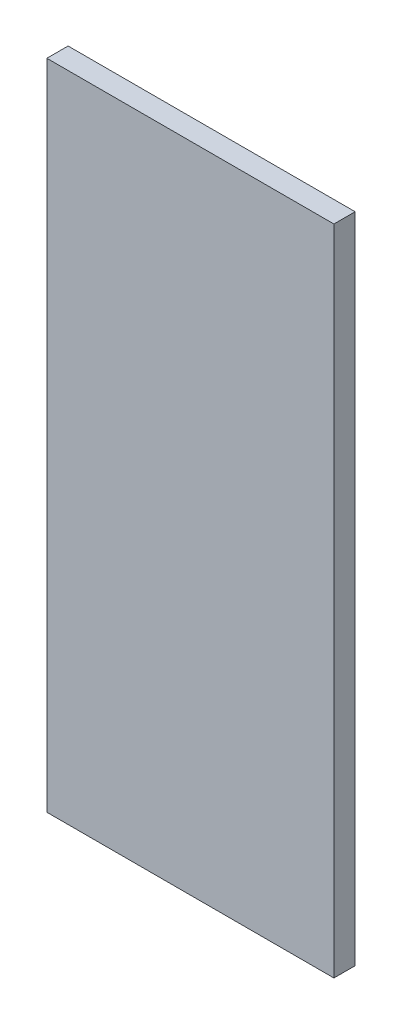
ISO-10303-21;
HEADER;
FILE_DESCRIPTION(('STEP AP214'),'2;1');
FILE_NAME('part.step','',(''),(''),'','','');
FILE_SCHEMA(('AUTOMOTIVE_DESIGN { 1 0 10303 214 1 1 1 1 }'));
ENDSEC;
DATA;
#1=APPLICATION_CONTEXT('core data for automotive mechanical design processes');
#2=APPLICATION_PROTOCOL_DEFINITION('international standard','automotive_design',2000,#1);
#3=PRODUCT_CONTEXT('',#1,'mechanical');
#4=PRODUCT('Part','Part','',(#3));
#5=PRODUCT_RELATED_PRODUCT_CATEGORY('part','',(#4));
#6=PRODUCT_DEFINITION_FORMATION('','',#4);
#7=PRODUCT_DEFINITION_CONTEXT('part definition',#1,'design');
#8=PRODUCT_DEFINITION('design','',#6,#7);
#9=PRODUCT_DEFINITION_SHAPE('','',#8);
#10=(LENGTH_UNIT() NAMED_UNIT(*) SI_UNIT(.MILLI.,.METRE.));
#11=(NAMED_UNIT(*) PLANE_ANGLE_UNIT() SI_UNIT($,.RADIAN.));
#12=(NAMED_UNIT(*) SI_UNIT($,.STERADIAN.) SOLID_ANGLE_UNIT());
#13=UNCERTAINTY_MEASURE_WITH_UNIT(LENGTH_MEASURE(1.E-05),#10,'distance_accuracy_value','');
#14=(GEOMETRIC_REPRESENTATION_CONTEXT(3) GLOBAL_UNCERTAINTY_ASSIGNED_CONTEXT((#13)) GLOBAL_UNIT_ASSIGNED_CONTEXT((#10,
#11,#12)) REPRESENTATION_CONTEXT('',''));
#15=CARTESIAN_POINT('',(0.,0.,0.));
#16=DIRECTION('',(0.,0.,1.));
#17=DIRECTION('',(1.,0.,0.));
#18=AXIS2_PLACEMENT_3D('',#15,#16,#17);
#19=CARTESIAN_POINT('',(0.,-15.4690455762306,-1.20000000000003));
#20=DIRECTION('',(0.,0.,1.));
#21=DIRECTION('',(1.,0.,0.));
#22=AXIS2_PLACEMENT_3D('',#19,#20,#21);
#23=PLANE('',#22);
#24=DIRECTION('',(1.,0.,0.));
#25=VECTOR('',#24,1.);
#26=CARTESIAN_POINT('',(0.,-14.8690455762306,-1.20000000000003));
#27=LINE('',#26,#25);
#28=CARTESIAN_POINT('',(-11.2173004717932,-14.8690455762306,-1.20000000000003));
#29=VERTEX_POINT('',#28);
#30=CARTESIAN_POINT('',(11.2173004717932,-14.8690455762306,-1.20000000000003));
#31=VERTEX_POINT('',#30);
#32=EDGE_CURVE('E117',#29,#31,#27,.T.);
#33=ORIENTED_EDGE('',*,*,#32,.T.);
#34=DIRECTION('',(0.,1.,0.));
#35=VECTOR('',#34,1.);
#36=CARTESIAN_POINT('',(11.2173004717932,-15.4690455762306,-1.20000000000003));
#37=LINE('',#36,#35);
#38=CARTESIAN_POINT('',(11.2173004717932,-15.4690455762306,-1.20000000000003));
#39=VERTEX_POINT('',#38);
#40=EDGE_CURVE('E12',#39,#31,#37,.T.);
#41=ORIENTED_EDGE('',*,*,#40,.F.);
#42=DIRECTION('',(1.,0.,0.));
#43=VECTOR('',#42,1.);
#44=CARTESIAN_POINT('',(0.,-15.4690455762306,-1.20000000000003));
#45=LINE('',#44,#43);
#46=CARTESIAN_POINT('',(-11.2173004717932,-15.4690455762306,-1.20000000000003));
#47=VERTEX_POINT('',#46);
#48=EDGE_CURVE('E105',#47,#39,#45,.T.);
#49=ORIENTED_EDGE('',*,*,#48,.F.);
#50=DIRECTION('',(0.,1.,0.));
#51=VECTOR('',#50,1.);
#52=CARTESIAN_POINT('',(-11.2173004717932,-15.4690455762306,-1.20000000000003));
#53=LINE('',#52,#51);
#54=EDGE_CURVE('E113',#47,#29,#53,.T.);
#55=ORIENTED_EDGE('',*,*,#54,.T.);
#56=EDGE_LOOP('',(#33,#41,#49,#55));
#57=FACE_BOUND('',#56,.T.);
#58=ADVANCED_FACE('F54',(#57),#23,.F.);
#59=CARTESIAN_POINT('',(11.2173004717932,-15.4690455762306,0.));
#60=DIRECTION('',(-1.,0.,0.));
#61=DIRECTION('',(0.,0.,1.));
#62=AXIS2_PLACEMENT_3D('',#59,#60,#61);
#63=PLANE('',#62);
#64=DIRECTION('',(0.,0.,1.));
#65=VECTOR('',#64,1.);
#66=CARTESIAN_POINT('',(11.2173004717932,-14.8690455762306,0.));
#67=LINE('',#66,#65);
#68=CARTESIAN_POINT('',(11.2173004717933,-14.8690455762306,-0.80000000000003));
#69=VERTEX_POINT('',#68);
#70=EDGE_CURVE('E109',#31,#69,#67,.T.);
#71=ORIENTED_EDGE('',*,*,#70,.T.);
#72=DIRECTION('',(0.,1.,0.));
#73=VECTOR('',#72,1.);
#74=CARTESIAN_POINT('',(11.2173004717933,-15.4690455762306,-0.80000000000003));
#75=LINE('',#74,#73);
#76=CARTESIAN_POINT('',(11.2173004717933,-15.4690455762306,-0.80000000000003));
#77=VERTEX_POINT('',#76);
#78=EDGE_CURVE('E62',#77,#69,#75,.T.);
#79=ORIENTED_EDGE('',*,*,#78,.F.);
#80=DIRECTION('',(0.,0.,1.));
#81=VECTOR('',#80,1.);
#82=CARTESIAN_POINT('',(11.2173004717932,-15.4690455762306,0.));
#83=LINE('',#82,#81);
#84=EDGE_CURVE('E100',#39,#77,#83,.T.);
#85=ORIENTED_EDGE('',*,*,#84,.F.);
#86=ORIENTED_EDGE('',*,*,#40,.T.);
#87=EDGE_LOOP('',(#71,#79,#85,#86));
#88=FACE_BOUND('',#87,.T.);
#89=ADVANCED_FACE('F108',(#88),#63,.F.);
#90=CARTESIAN_POINT('',(0.,-15.4690455762306,-0.80000000000003));
#91=DIRECTION('',(0.,0.,-1.));
#92=DIRECTION('',(-1.,0.,0.));
#93=AXIS2_PLACEMENT_3D('',#90,#91,#92);
#94=PLANE('',#93);
#95=DIRECTION('',(-1.,0.,0.));
#96=VECTOR('',#95,1.);
#97=CARTESIAN_POINT('',(0.,-14.8690455762306,-0.80000000000003));
#98=LINE('',#97,#96);
#99=CARTESIAN_POINT('',(-11.2173004717933,-14.8690455762306,-0.80000000000003));
#100=VERTEX_POINT('',#99);
#101=EDGE_CURVE('E87',#69,#100,#98,.T.);
#102=ORIENTED_EDGE('',*,*,#101,.T.);
#103=DIRECTION('',(0.,1.,0.));
#104=VECTOR('',#103,1.);
#105=CARTESIAN_POINT('',(-11.2173004717933,-15.4690455762306,-0.80000000000003));
#106=LINE('',#105,#104);
#107=CARTESIAN_POINT('',(-11.2173004717933,-15.4690455762306,-0.80000000000003));
#108=VERTEX_POINT('',#107);
#109=EDGE_CURVE('E110',#108,#100,#106,.T.);
#110=ORIENTED_EDGE('',*,*,#109,.F.);
#111=DIRECTION('',(-1.,0.,0.));
#112=VECTOR('',#111,1.);
#113=CARTESIAN_POINT('',(0.,-15.4690455762306,-0.80000000000003));
#114=LINE('',#113,#112);
#115=EDGE_CURVE('E103',#77,#108,#114,.T.);
#116=ORIENTED_EDGE('',*,*,#115,.F.);
#117=ORIENTED_EDGE('',*,*,#78,.T.);
#118=EDGE_LOOP('',(#102,#110,#116,#117));
#119=FACE_BOUND('',#118,.T.);
#120=ADVANCED_FACE('F111',(#119),#94,.F.);
#121=CARTESIAN_POINT('',(-11.2173004717932,-15.4690455762306,0.));
#122=DIRECTION('',(1.,0.,0.));
#123=DIRECTION('',(0.,0.,-1.));
#124=AXIS2_PLACEMENT_3D('',#121,#122,#123);
#125=PLANE('',#124);
#126=DIRECTION('',(0.,0.,-1.));
#127=VECTOR('',#126,1.);
#128=CARTESIAN_POINT('',(-11.2173004717932,-14.8690455762306,0.));
#129=LINE('',#128,#127);
#130=EDGE_CURVE('E93',#100,#29,#129,.T.);
#131=ORIENTED_EDGE('',*,*,#130,.T.);
#132=ORIENTED_EDGE('',*,*,#54,.F.);
#133=DIRECTION('',(0.,0.,-1.));
#134=VECTOR('',#133,1.);
#135=CARTESIAN_POINT('',(-11.2173004717932,-15.4690455762306,0.));
#136=LINE('',#135,#134);
#137=EDGE_CURVE('E70',#108,#47,#136,.T.);
#138=ORIENTED_EDGE('',*,*,#137,.F.);
#139=ORIENTED_EDGE('',*,*,#109,.T.);
#140=EDGE_LOOP('',(#131,#132,#138,#139));
#141=FACE_BOUND('',#140,.T.);
#142=ADVANCED_FACE('F124',(#141),#125,.F.);
#143=CARTESIAN_POINT('',(0.,-15.4690455762306,0.));
#144=DIRECTION('',(0.,-1.,0.));
#145=DIRECTION('',(0.,0.,-1.));
#146=AXIS2_PLACEMENT_3D('',#143,#144,#145);
#147=PLANE('',#146);
#148=ORIENTED_EDGE('',*,*,#48,.T.);
#149=ORIENTED_EDGE('',*,*,#84,.T.);
#150=ORIENTED_EDGE('',*,*,#115,.T.);
#151=ORIENTED_EDGE('',*,*,#137,.T.);
#152=EDGE_LOOP('',(#148,#149,#150,#151));
#153=FACE_BOUND('',#152,.T.);
#154=ADVANCED_FACE('F101',(#153),#147,.T.);
#155=CARTESIAN_POINT('',(0.,-14.8690455762306,0.));
#156=DIRECTION('',(0.,-1.,0.));
#157=DIRECTION('',(0.,0.,-1.));
#158=AXIS2_PLACEMENT_3D('',#155,#156,#157);
#159=PLANE('',#158);
#160=ORIENTED_EDGE('',*,*,#32,.F.);
#161=ORIENTED_EDGE('',*,*,#130,.F.);
#162=ORIENTED_EDGE('',*,*,#101,.F.);
#163=ORIENTED_EDGE('',*,*,#70,.F.);
#164=EDGE_LOOP('',(#160,#161,#162,#163));
#165=FACE_BOUND('',#164,.T.);
#166=ADVANCED_FACE('F127',(#165),#159,.F.);
#167=CLOSED_SHELL('',(#58,#89,#120,#142,#154,#166));
#168=MANIFOLD_SOLID_BREP('B2',#167);
#169=CARTESIAN_POINT('',(11.2173004717933,0.,-1.));
#170=DIRECTION('',(1.,0.,0.));
#171=DIRECTION('',(0.,0.,-1.));
#172=AXIS2_PLACEMENT_3D('',#169,#170,#171);
#173=PLANE('',#172);
#174=DIRECTION('',(0.,1.,0.));
#175=VECTOR('',#174,1.);
#176=CARTESIAN_POINT('',(11.2173004717933,0.,0.));
#177=LINE('',#176,#175);
#178=CARTESIAN_POINT('',(11.2173004717933,-14.8690455762306,0.));
#179=VERTEX_POINT('',#178);
#180=CARTESIAN_POINT('',(11.2173004717933,44.0338466836087,0.));
#181=VERTEX_POINT('',#180);
#182=EDGE_CURVE('E262',#179,#181,#177,.T.);
#183=ORIENTED_EDGE('',*,*,#182,.F.);
#184=DIRECTION('',(0.,0.,1.));
#185=VECTOR('',#184,1.);
#186=CARTESIAN_POINT('',(11.2173004717933,-14.8690455762306,-1.));
#187=LINE('',#186,#185);
#188=CARTESIAN_POINT('',(11.2173004717933,-14.8690455762306,-1.));
#189=VERTEX_POINT('',#188);
#190=EDGE_CURVE('E52',#189,#179,#187,.T.);
#191=ORIENTED_EDGE('',*,*,#190,.F.);
#192=DIRECTION('',(0.,1.,0.));
#193=VECTOR('',#192,1.);
#194=CARTESIAN_POINT('',(11.2173004717933,0.,-1.));
#195=LINE('',#194,#193);
#196=CARTESIAN_POINT('',(11.2173004717933,44.0338466836087,-1.));
#197=VERTEX_POINT('',#196);
#198=EDGE_CURVE('E247',#189,#197,#195,.T.);
#199=ORIENTED_EDGE('',*,*,#198,.T.);
#200=DIRECTION('',(0.,0.,1.));
#201=VECTOR('',#200,1.);
#202=CARTESIAN_POINT('',(11.2173004717933,44.0338466836087,-1.));
#203=LINE('',#202,#201);
#204=EDGE_CURVE('E215',#197,#181,#203,.T.);
#205=ORIENTED_EDGE('',*,*,#204,.T.);
#206=EDGE_LOOP('',(#183,#191,#199,#205));
#207=FACE_BOUND('',#206,.T.);
#208=ADVANCED_FACE('F199',(#207),#173,.T.);
#209=CARTESIAN_POINT('',(0.,-14.8690455762306,-1.));
#210=DIRECTION('',(0.,1.,0.));
#211=DIRECTION('',(0.,0.,1.));
#212=AXIS2_PLACEMENT_3D('',#209,#210,#211);
#213=PLANE('',#212);
#214=DIRECTION('',(-1.,0.,0.));
#215=VECTOR('',#214,1.);
#216=CARTESIAN_POINT('',(0.,-14.8690455762306,0.));
#217=LINE('',#216,#215);
#218=CARTESIAN_POINT('',(-11.2173004717933,-14.8690455762306,0.));
#219=VERTEX_POINT('',#218);
#220=EDGE_CURVE('E253',#179,#219,#217,.T.);
#221=ORIENTED_EDGE('',*,*,#220,.T.);
#222=DIRECTION('',(0.,0.,1.));
#223=VECTOR('',#222,1.);
#224=CARTESIAN_POINT('',(-11.2173004717933,-14.8690455762306,-1.));
#225=LINE('',#224,#223);
#226=CARTESIAN_POINT('',(-11.2173004717933,-14.8690455762306,-1.));
#227=VERTEX_POINT('',#226);
#228=EDGE_CURVE('E207',#227,#219,#225,.T.);
#229=ORIENTED_EDGE('',*,*,#228,.F.);
#230=DIRECTION('',(-1.,0.,0.));
#231=VECTOR('',#230,1.);
#232=CARTESIAN_POINT('',(0.,-14.8690455762306,-1.));
#233=LINE('',#232,#231);
#234=EDGE_CURVE('E241',#189,#227,#233,.T.);
#235=ORIENTED_EDGE('',*,*,#234,.F.);
#236=ORIENTED_EDGE('',*,*,#190,.T.);
#237=EDGE_LOOP('',(#221,#229,#235,#236));
#238=FACE_BOUND('',#237,.T.);
#239=ADVANCED_FACE('F251',(#238),#213,.F.);
#240=CARTESIAN_POINT('',(-11.2173004717933,0.,-1.));
#241=DIRECTION('',(1.,0.,0.));
#242=DIRECTION('',(0.,0.,-1.));
#243=AXIS2_PLACEMENT_3D('',#240,#241,#242);
#244=PLANE('',#243);
#245=DIRECTION('',(0.,1.,0.));
#246=VECTOR('',#245,1.);
#247=CARTESIAN_POINT('',(-11.2173004717933,0.,0.));
#248=LINE('',#247,#246);
#249=CARTESIAN_POINT('',(-11.2173004717933,44.0338466836087,0.));
#250=VERTEX_POINT('',#249);
#251=EDGE_CURVE('E265',#219,#250,#248,.T.);
#252=ORIENTED_EDGE('',*,*,#251,.T.);
#253=DIRECTION('',(0.,0.,1.));
#254=VECTOR('',#253,1.);
#255=CARTESIAN_POINT('',(-11.2173004717933,44.0338466836087,-1.));
#256=LINE('',#255,#254);
#257=CARTESIAN_POINT('',(-11.2173004717933,44.0338466836087,-1.));
#258=VERTEX_POINT('',#257);
#259=EDGE_CURVE('E229',#258,#250,#256,.T.);
#260=ORIENTED_EDGE('',*,*,#259,.F.);
#261=DIRECTION('',(0.,1.,0.));
#262=VECTOR('',#261,1.);
#263=CARTESIAN_POINT('',(-11.2173004717933,0.,-1.));
#264=LINE('',#263,#262);
#265=EDGE_CURVE('E246',#227,#258,#264,.T.);
#266=ORIENTED_EDGE('',*,*,#265,.F.);
#267=ORIENTED_EDGE('',*,*,#228,.T.);
#268=EDGE_LOOP('',(#252,#260,#266,#267));
#269=FACE_BOUND('',#268,.T.);
#270=ADVANCED_FACE('F256',(#269),#244,.F.);
#271=CARTESIAN_POINT('',(0.,44.0338466836087,-1.));
#272=DIRECTION('',(0.,1.,0.));
#273=DIRECTION('',(0.,0.,1.));
#274=AXIS2_PLACEMENT_3D('',#271,#272,#273);
#275=PLANE('',#274);
#276=DIRECTION('',(-1.,0.,0.));
#277=VECTOR('',#276,1.);
#278=CARTESIAN_POINT('',(0.,44.0338466836087,0.));
#279=LINE('',#278,#277);
#280=EDGE_CURVE('E267',#181,#250,#279,.T.);
#281=ORIENTED_EDGE('',*,*,#280,.F.);
#282=ORIENTED_EDGE('',*,*,#204,.F.);
#283=DIRECTION('',(-1.,0.,0.));
#284=VECTOR('',#283,1.);
#285=CARTESIAN_POINT('',(0.,44.0338466836087,-1.));
#286=LINE('',#285,#284);
#287=EDGE_CURVE('E257',#197,#258,#286,.T.);
#288=ORIENTED_EDGE('',*,*,#287,.T.);
#289=ORIENTED_EDGE('',*,*,#259,.T.);
#290=EDGE_LOOP('',(#281,#282,#288,#289));
#291=FACE_BOUND('',#290,.T.);
#292=ADVANCED_FACE('F272',(#291),#275,.T.);
#293=CARTESIAN_POINT('',(0.,0.,-1.));
#294=DIRECTION('',(0.,0.,-1.));
#295=DIRECTION('',(-1.,0.,0.));
#296=AXIS2_PLACEMENT_3D('',#293,#294,#295);
#297=PLANE('',#296);
#298=ORIENTED_EDGE('',*,*,#198,.F.);
#299=ORIENTED_EDGE('',*,*,#234,.T.);
#300=ORIENTED_EDGE('',*,*,#265,.T.);
#301=ORIENTED_EDGE('',*,*,#287,.F.);
#302=EDGE_LOOP('',(#298,#299,#300,#301));
#303=FACE_BOUND('',#302,.T.);
#304=ADVANCED_FACE('F243',(#303),#297,.T.);
#305=CARTESIAN_POINT('',(0.,0.,0.));
#306=DIRECTION('',(0.,0.,-1.));
#307=DIRECTION('',(-1.,0.,0.));
#308=AXIS2_PLACEMENT_3D('',#305,#306,#307);
#309=PLANE('',#308);
#310=ORIENTED_EDGE('',*,*,#182,.T.);
#311=ORIENTED_EDGE('',*,*,#280,.T.);
#312=ORIENTED_EDGE('',*,*,#251,.F.);
#313=ORIENTED_EDGE('',*,*,#220,.F.);
#314=EDGE_LOOP('',(#310,#311,#312,#313));
#315=FACE_BOUND('',#314,.T.);
#316=ADVANCED_FACE('F279',(#315),#309,.F.);
#317=CLOSED_SHELL('',(#208,#239,#270,#292,#304,#316));
#318=MANIFOLD_SOLID_BREP('B6',#317);
#319=CARTESIAN_POINT('',(13.5173004717932,0.,2.));
#320=DIRECTION('',(1.,0.,0.));
#321=DIRECTION('',(0.,0.,-1.));
#322=AXIS2_PLACEMENT_3D('',#319,#320,#321);
#323=PLANE('',#322);
#324=DIRECTION('',(0.,-1.,0.));
#325=VECTOR('',#324,1.);
#326=CARTESIAN_POINT('',(13.5173004717932,0.,0.));
#327=LINE('',#326,#325);
#328=CARTESIAN_POINT('',(13.5173004717932,46.3338466836086,0.));
#329=VERTEX_POINT('',#328);
#330=CARTESIAN_POINT('',(13.5173004717932,-15.1690455762306,0.));
#331=VERTEX_POINT('',#330);
#332=EDGE_CURVE('E386',#329,#331,#327,.T.);
#333=ORIENTED_EDGE('',*,*,#332,.F.);
#334=DIRECTION('',(0.,0.,-1.));
#335=VECTOR('',#334,1.);
#336=CARTESIAN_POINT('',(13.5173004717932,46.3338466836086,2.));
#337=LINE('',#336,#335);
#338=CARTESIAN_POINT('',(13.5173004717932,46.3338466836086,2.));
#339=VERTEX_POINT('',#338);
#340=EDGE_CURVE('E197',#339,#329,#337,.T.);
#341=ORIENTED_EDGE('',*,*,#340,.F.);
#342=DIRECTION('',(0.,-1.,0.));
#343=VECTOR('',#342,1.);
#344=CARTESIAN_POINT('',(13.5173004717932,0.,2.));
#345=LINE('',#344,#343);
#346=CARTESIAN_POINT('',(13.5173004717932,-15.1690455762306,2.));
#347=VERTEX_POINT('',#346);
#348=EDGE_CURVE('E380',#339,#347,#345,.T.);
#349=ORIENTED_EDGE('',*,*,#348,.T.);
#350=DIRECTION('',(0.,0.,-1.));
#351=VECTOR('',#350,1.);
#352=CARTESIAN_POINT('',(13.5173004717932,-15.1690455762306,2.));
#353=LINE('',#352,#351);
#354=EDGE_CURVE('E361',#347,#331,#353,.T.);
#355=ORIENTED_EDGE('',*,*,#354,.T.);
#356=EDGE_LOOP('',(#333,#341,#349,#355));
#357=FACE_BOUND('',#356,.T.);
#358=ADVANCED_FACE('F323',(#357),#323,.T.);
#359=CARTESIAN_POINT('',(0.,46.3338466836086,2.));
#360=DIRECTION('',(0.,1.,0.));
#361=DIRECTION('',(0.,0.,1.));
#362=AXIS2_PLACEMENT_3D('',#359,#360,#361);
#363=PLANE('',#362);
#364=DIRECTION('',(1.,0.,0.));
#365=VECTOR('',#364,1.);
#366=CARTESIAN_POINT('',(0.,46.3338466836086,0.));
#367=LINE('',#366,#365);
#368=CARTESIAN_POINT('',(-13.5173004717932,46.3338466836086,0.));
#369=VERTEX_POINT('',#368);
#370=EDGE_CURVE('E374',#369,#329,#367,.T.);
#371=ORIENTED_EDGE('',*,*,#370,.F.);
#372=DIRECTION('',(0.,0.,-1.));
#373=VECTOR('',#372,1.);
#374=CARTESIAN_POINT('',(-13.5173004717932,46.3338466836086,2.));
#375=LINE('',#374,#373);
#376=CARTESIAN_POINT('',(-13.5173004717932,46.3338466836086,2.));
#377=VERTEX_POINT('',#376);
#378=EDGE_CURVE('E331',#377,#369,#375,.T.);
#379=ORIENTED_EDGE('',*,*,#378,.F.);
#380=DIRECTION('',(1.,0.,0.));
#381=VECTOR('',#380,1.);
#382=CARTESIAN_POINT('',(0.,46.3338466836086,2.));
#383=LINE('',#382,#381);
#384=EDGE_CURVE('E372',#377,#339,#383,.T.);
#385=ORIENTED_EDGE('',*,*,#384,.T.);
#386=ORIENTED_EDGE('',*,*,#340,.T.);
#387=EDGE_LOOP('',(#371,#379,#385,#386));
#388=FACE_BOUND('',#387,.T.);
#389=ADVANCED_FACE('F370',(#388),#363,.T.);
#390=CARTESIAN_POINT('',(-13.5173004717932,0.,2.));
#391=DIRECTION('',(1.,0.,0.));
#392=DIRECTION('',(0.,0.,-1.));
#393=AXIS2_PLACEMENT_3D('',#390,#391,#392);
#394=PLANE('',#393);
#395=DIRECTION('',(0.,-1.,0.));
#396=VECTOR('',#395,1.);
#397=CARTESIAN_POINT('',(-13.5173004717932,0.,0.));
#398=LINE('',#397,#396);
#399=CARTESIAN_POINT('',(-13.5173004717932,-15.1690455762306,0.));
#400=VERTEX_POINT('',#399);
#401=EDGE_CURVE('E354',#369,#400,#398,.T.);
#402=ORIENTED_EDGE('',*,*,#401,.T.);
#403=DIRECTION('',(0.,0.,-1.));
#404=VECTOR('',#403,1.);
#405=CARTESIAN_POINT('',(-13.5173004717932,-15.1690455762306,2.));
#406=LINE('',#405,#404);
#407=CARTESIAN_POINT('',(-13.5173004717932,-15.1690455762306,2.));
#408=VERTEX_POINT('',#407);
#409=EDGE_CURVE('E375',#408,#400,#406,.T.);
#410=ORIENTED_EDGE('',*,*,#409,.F.);
#411=DIRECTION('',(0.,-1.,0.));
#412=VECTOR('',#411,1.);
#413=CARTESIAN_POINT('',(-13.5173004717932,0.,2.));
#414=LINE('',#413,#412);
#415=EDGE_CURVE('E376',#377,#408,#414,.T.);
#416=ORIENTED_EDGE('',*,*,#415,.F.);
#417=ORIENTED_EDGE('',*,*,#378,.T.);
#418=EDGE_LOOP('',(#402,#410,#416,#417));
#419=FACE_BOUND('',#418,.T.);
#420=ADVANCED_FACE('F377',(#419),#394,.F.);
#421=CARTESIAN_POINT('',(0.,-15.1690455762306,2.));
#422=DIRECTION('',(0.,1.,0.));
#423=DIRECTION('',(0.,0.,1.));
#424=AXIS2_PLACEMENT_3D('',#421,#422,#423);
#425=PLANE('',#424);
#426=DIRECTION('',(1.,0.,0.));
#427=VECTOR('',#426,1.);
#428=CARTESIAN_POINT('',(0.,-15.1690455762306,0.));
#429=LINE('',#428,#427);
#430=EDGE_CURVE('E382',#400,#331,#429,.T.);
#431=ORIENTED_EDGE('',*,*,#430,.T.);
#432=ORIENTED_EDGE('',*,*,#354,.F.);
#433=DIRECTION('',(1.,0.,0.));
#434=VECTOR('',#433,1.);
#435=CARTESIAN_POINT('',(0.,-15.1690455762306,2.));
#436=LINE('',#435,#434);
#437=EDGE_CURVE('E339',#408,#347,#436,.T.);
#438=ORIENTED_EDGE('',*,*,#437,.F.);
#439=ORIENTED_EDGE('',*,*,#409,.T.);
#440=EDGE_LOOP('',(#431,#432,#438,#439));
#441=FACE_BOUND('',#440,.T.);
#442=ADVANCED_FACE('F395',(#441),#425,.F.);
#443=CARTESIAN_POINT('',(0.,0.,2.));
#444=DIRECTION('',(0.,0.,1.));
#445=DIRECTION('',(1.,0.,0.));
#446=AXIS2_PLACEMENT_3D('',#443,#444,#445);
#447=PLANE('',#446);
#448=ORIENTED_EDGE('',*,*,#348,.F.);
#449=ORIENTED_EDGE('',*,*,#384,.F.);
#450=ORIENTED_EDGE('',*,*,#415,.T.);
#451=ORIENTED_EDGE('',*,*,#437,.T.);
#452=EDGE_LOOP('',(#448,#449,#450,#451));
#453=FACE_BOUND('',#452,.T.);
#454=ADVANCED_FACE('F379',(#453),#447,.T.);
#455=CARTESIAN_POINT('',(0.,0.,0.));
#456=DIRECTION('',(0.,0.,1.));
#457=DIRECTION('',(1.,0.,0.));
#458=AXIS2_PLACEMENT_3D('',#455,#456,#457);
#459=PLANE('',#458);
#460=ORIENTED_EDGE('',*,*,#332,.T.);
#461=ORIENTED_EDGE('',*,*,#430,.F.);
#462=ORIENTED_EDGE('',*,*,#401,.F.);
#463=ORIENTED_EDGE('',*,*,#370,.T.);
#464=EDGE_LOOP('',(#460,#461,#462,#463));
#465=FACE_BOUND('',#464,.T.);
#466=ADVANCED_FACE('F397',(#465),#459,.F.);
#467=CLOSED_SHELL('',(#358,#389,#420,#442,#454,#466));
#468=MANIFOLD_SOLID_BREP('B46',#467);
#469=ADVANCED_BREP_SHAPE_REPRESENTATION('',(#18,#168,#318,#468),#14);
#470=SHAPE_DEFINITION_REPRESENTATION(#9,#469);
ENDSEC;
END-ISO-10303-21;
